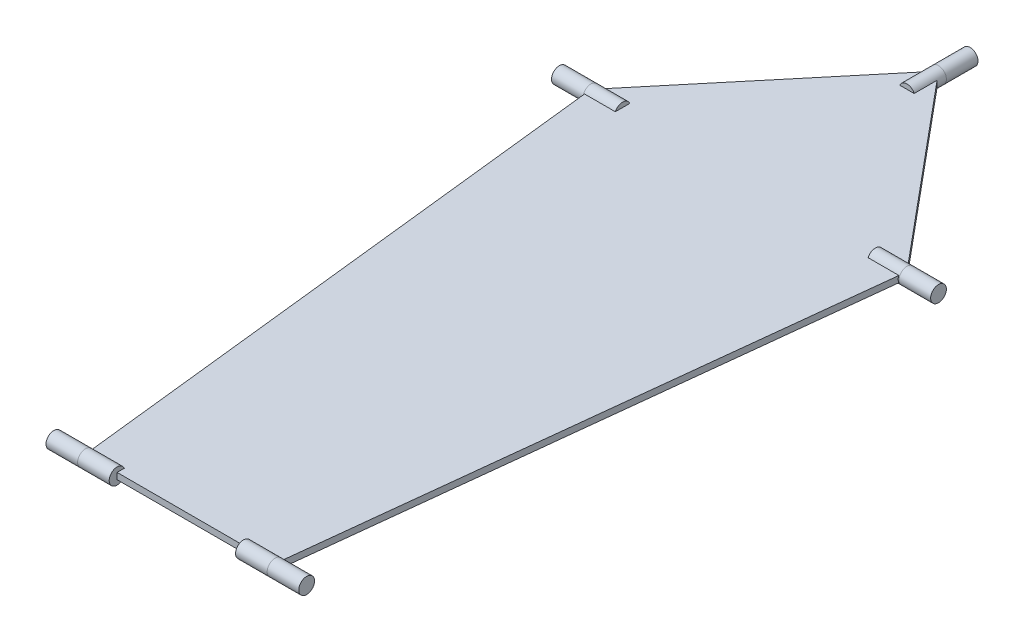
ISO-10303-21;
HEADER;
FILE_DESCRIPTION(('STEP AP214'),'2;1');
FILE_NAME('part.step','',(''),(''),'','','');
FILE_SCHEMA(('AUTOMOTIVE_DESIGN { 1 0 10303 214 1 1 1 1 }'));
ENDSEC;
DATA;
#1=APPLICATION_CONTEXT('core data for automotive mechanical design processes');
#2=APPLICATION_PROTOCOL_DEFINITION('international standard','automotive_design',2000,#1);
#3=PRODUCT_CONTEXT('',#1,'mechanical');
#4=PRODUCT('Part','Part','',(#3));
#5=PRODUCT_RELATED_PRODUCT_CATEGORY('part','',(#4));
#6=PRODUCT_DEFINITION_FORMATION('','',#4);
#7=PRODUCT_DEFINITION_CONTEXT('part definition',#1,'design');
#8=PRODUCT_DEFINITION('design','',#6,#7);
#9=PRODUCT_DEFINITION_SHAPE('','',#8);
#10=(LENGTH_UNIT() NAMED_UNIT(*) SI_UNIT(.MILLI.,.METRE.));
#11=(NAMED_UNIT(*) PLANE_ANGLE_UNIT() SI_UNIT($,.RADIAN.));
#12=(NAMED_UNIT(*) SI_UNIT($,.STERADIAN.) SOLID_ANGLE_UNIT());
#13=UNCERTAINTY_MEASURE_WITH_UNIT(LENGTH_MEASURE(1.E-05),#10,'distance_accuracy_value','');
#14=(GEOMETRIC_REPRESENTATION_CONTEXT(3) GLOBAL_UNCERTAINTY_ASSIGNED_CONTEXT((#13)) GLOBAL_UNIT_ASSIGNED_CONTEXT((#10,
#11,#12)) REPRESENTATION_CONTEXT('',''));
#15=CARTESIAN_POINT('',(0.,0.,0.));
#16=DIRECTION('',(0.,0.,1.));
#17=DIRECTION('',(1.,0.,0.));
#18=AXIS2_PLACEMENT_3D('',#15,#16,#17);
#19=CARTESIAN_POINT('',(0.,1.27,0.));
#20=DIRECTION('',(0.,1.,0.));
#21=DIRECTION('',(0.,0.,1.));
#22=AXIS2_PLACEMENT_3D('',#19,#20,#21);
#23=PLANE('',#22);
#24=DIRECTION('',(-1.,0.,0.));
#25=VECTOR('',#24,1.);
#26=CARTESIAN_POINT('',(2.28716997076464E-13,1.27,-139.7));
#27=LINE('',#26,#25);
#28=CARTESIAN_POINT('',(2.90993556629696,1.27,-139.7));
#29=VERTEX_POINT('',#28);
#30=CARTESIAN_POINT('',(-2.90993556629695,1.27,-139.7));
#31=VERTEX_POINT('',#30);
#32=EDGE_CURVE('E246',#29,#31,#27,.T.);
#33=ORIENTED_EDGE('',*,*,#32,.T.);
#34=DIRECTION('',(0.,0.,1.));
#35=VECTOR('',#34,1.);
#36=CARTESIAN_POINT('',(-2.90993556629694,1.27,-152.4));
#37=LINE('',#36,#35);
#38=CARTESIAN_POINT('',(-2.90993556629696,1.27,-148.908077320444));
#39=VERTEX_POINT('',#38);
#40=EDGE_CURVE('E236',#31,#39,#37,.F.);
#41=ORIENTED_EDGE('',*,*,#40,.T.);
#42=DIRECTION('',(-0.64018439966448,0.,0.768221279597376));
#43=VECTOR('',#42,1.);
#44=CARTESIAN_POINT('',(-63.5,1.27,-76.2));
#45=LINE('',#44,#43);
#46=CARTESIAN_POINT('',(-61.0750536947525,1.27,-79.1099355662969));
#47=VERTEX_POINT('',#46);
#48=EDGE_CURVE('E407',#39,#47,#45,.T.);
#49=ORIENTED_EDGE('',*,*,#48,.T.);
#50=DIRECTION('',(-1.,0.,0.));
#51=VECTOR('',#50,1.);
#52=CARTESIAN_POINT('',(-50.8,1.27,-79.1099355662969));
#53=LINE('',#52,#51);
#54=CARTESIAN_POINT('',(-50.8,1.27,-79.1099355662969));
#55=VERTEX_POINT('',#54);
#56=EDGE_CURVE('E378',#47,#55,#53,.F.);
#57=ORIENTED_EDGE('',*,*,#56,.T.);
#58=DIRECTION('',(0.,0.,-1.));
#59=VECTOR('',#58,1.);
#60=CARTESIAN_POINT('',(-50.8,1.27,0.));
#61=LINE('',#60,#59);
#62=CARTESIAN_POINT('',(-50.8,1.27,-73.290064433703));
#63=VERTEX_POINT('',#62);
#64=EDGE_CURVE('E381',#63,#55,#61,.T.);
#65=ORIENTED_EDGE('',*,*,#64,.F.);
#66=DIRECTION('',(-1.,0.,0.));
#67=VECTOR('',#66,1.);
#68=CARTESIAN_POINT('',(-50.8,1.27,-73.290064433703));
#69=LINE('',#68,#67);
#70=CARTESIAN_POINT('',(-63.176673825967,1.27,-73.290064433703));
#71=VERTEX_POINT('',#70);
#72=EDGE_CURVE('E371',#63,#71,#69,.T.);
#73=ORIENTED_EDGE('',*,*,#72,.T.);
#74=DIRECTION('',(0.110431526074847,0.,0.993883734673619));
#75=VECTOR('',#74,1.);
#76=CARTESIAN_POINT('',(-38.1,1.27,152.4));
#77=LINE('',#76,#75);
#78=CARTESIAN_POINT('',(-38.423326174033,1.27,149.490064433703));
#79=VERTEX_POINT('',#78);
#80=EDGE_CURVE('E399',#71,#79,#77,.T.);
#81=ORIENTED_EDGE('',*,*,#80,.T.);
#82=DIRECTION('',(-1.,0.,0.));
#83=VECTOR('',#82,1.);
#84=CARTESIAN_POINT('',(-38.1,1.27,149.490064433703));
#85=LINE('',#84,#83);
#86=CARTESIAN_POINT('',(-38.1,1.27,149.490064433703));
#87=VERTEX_POINT('',#86);
#88=EDGE_CURVE('E346',#87,#79,#85,.T.);
#89=ORIENTED_EDGE('',*,*,#88,.F.);
#90=DIRECTION('',(-1.,0.,0.));
#91=VECTOR('',#90,1.);
#92=CARTESIAN_POINT('',(-25.4,1.27,149.490064433703));
#93=LINE('',#92,#91);
#94=CARTESIAN_POINT('',(-25.4,1.27,149.490064433703));
#95=VERTEX_POINT('',#94);
#96=EDGE_CURVE('E350',#95,#87,#93,.T.);
#97=ORIENTED_EDGE('',*,*,#96,.F.);
#98=DIRECTION('',(0.,0.,1.));
#99=VECTOR('',#98,1.);
#100=CARTESIAN_POINT('',(-25.4,1.27,0.));
#101=LINE('',#100,#99);
#102=CARTESIAN_POINT('',(-25.4,1.27,152.4));
#103=VERTEX_POINT('',#102);
#104=EDGE_CURVE('E339',#95,#103,#101,.T.);
#105=ORIENTED_EDGE('',*,*,#104,.T.);
#106=DIRECTION('',(1.,0.,0.));
#107=VECTOR('',#106,1.);
#108=CARTESIAN_POINT('',(0.,1.27,152.4));
#109=LINE('',#108,#107);
#110=CARTESIAN_POINT('',(25.4,1.27,152.4));
#111=VERTEX_POINT('',#110);
#112=EDGE_CURVE('E403',#103,#111,#109,.T.);
#113=ORIENTED_EDGE('',*,*,#112,.T.);
#114=DIRECTION('',(0.,0.,-1.));
#115=VECTOR('',#114,1.);
#116=CARTESIAN_POINT('',(25.4,1.27,0.));
#117=LINE('',#116,#115);
#118=CARTESIAN_POINT('',(25.4,1.27,149.490064433703));
#119=VERTEX_POINT('',#118);
#120=EDGE_CURVE('E123',#111,#119,#117,.T.);
#121=ORIENTED_EDGE('',*,*,#120,.T.);
#122=DIRECTION('',(1.,0.,0.));
#123=VECTOR('',#122,1.);
#124=CARTESIAN_POINT('',(25.4,1.27,149.490064433703));
#125=LINE('',#124,#123);
#126=CARTESIAN_POINT('',(38.1,1.27,149.490064433703));
#127=VERTEX_POINT('',#126);
#128=EDGE_CURVE('E285',#127,#119,#125,.F.);
#129=ORIENTED_EDGE('',*,*,#128,.F.);
#130=DIRECTION('',(1.,0.,0.));
#131=VECTOR('',#130,1.);
#132=CARTESIAN_POINT('',(38.1,1.27,149.490064433703));
#133=LINE('',#132,#131);
#134=CARTESIAN_POINT('',(38.423326174033,1.27,149.490064433703));
#135=VERTEX_POINT('',#134);
#136=EDGE_CURVE('E275',#135,#127,#133,.F.);
#137=ORIENTED_EDGE('',*,*,#136,.F.);
#138=DIRECTION('',(-0.110431526074847,0.,0.993883734673619));
#139=VECTOR('',#138,1.);
#140=CARTESIAN_POINT('',(38.1,1.27,152.4));
#141=LINE('',#140,#139);
#142=CARTESIAN_POINT('',(63.176673825967,1.27,-73.290064433703));
#143=VERTEX_POINT('',#142);
#144=EDGE_CURVE('E386',#143,#135,#141,.T.);
#145=ORIENTED_EDGE('',*,*,#144,.F.);
#146=DIRECTION('',(1.,0.,0.));
#147=VECTOR('',#146,1.);
#148=CARTESIAN_POINT('',(50.8,1.27,-73.290064433703));
#149=LINE('',#148,#147);
#150=CARTESIAN_POINT('',(50.8,1.27,-73.290064433703));
#151=VERTEX_POINT('',#150);
#152=EDGE_CURVE('E316',#143,#151,#149,.F.);
#153=ORIENTED_EDGE('',*,*,#152,.T.);
#154=DIRECTION('',(0.,0.,1.));
#155=VECTOR('',#154,1.);
#156=CARTESIAN_POINT('',(50.8,1.27,0.));
#157=LINE('',#156,#155);
#158=CARTESIAN_POINT('',(50.8,1.27,-79.1099355662969));
#159=VERTEX_POINT('',#158);
#160=EDGE_CURVE('E320',#159,#151,#157,.T.);
#161=ORIENTED_EDGE('',*,*,#160,.F.);
#162=DIRECTION('',(1.,0.,0.));
#163=VECTOR('',#162,1.);
#164=CARTESIAN_POINT('',(50.8,1.27,-79.1099355662969));
#165=LINE('',#164,#163);
#166=CARTESIAN_POINT('',(61.0750536947525,1.27,-79.1099355662969));
#167=VERTEX_POINT('',#166);
#168=EDGE_CURVE('E305',#159,#167,#165,.T.);
#169=ORIENTED_EDGE('',*,*,#168,.T.);
#170=DIRECTION('',(0.64018439966448,0.,0.768221279597376));
#171=VECTOR('',#170,1.);
#172=CARTESIAN_POINT('',(63.5,1.27,-76.2));
#173=LINE('',#172,#171);
#174=CARTESIAN_POINT('',(2.909935566297,1.27,-148.908077320444));
#175=VERTEX_POINT('',#174);
#176=EDGE_CURVE('E389',#175,#167,#173,.T.);
#177=ORIENTED_EDGE('',*,*,#176,.F.);
#178=DIRECTION('',(0.,0.,1.));
#179=VECTOR('',#178,1.);
#180=CARTESIAN_POINT('',(2.90993556629698,1.27,-152.4));
#181=LINE('',#180,#179);
#182=EDGE_CURVE('E115',#175,#29,#181,.T.);
#183=ORIENTED_EDGE('',*,*,#182,.T.);
#184=EDGE_LOOP('',(#33,#41,#49,#57,#65,#73,#81,#89,#97,#105,#113,#121,#129,#137,#145,#153,#161,
#169,#177,#183));
#185=FACE_BOUND('',#184,.T.);
#186=ADVANCED_FACE('F99',(#185),#23,.T.);
#187=CARTESIAN_POINT('',(0.,-1.27,0.));
#188=DIRECTION('',(0.,1.,0.));
#189=DIRECTION('',(0.,0.,1.));
#190=AXIS2_PLACEMENT_3D('',#187,#188,#189);
#191=PLANE('',#190);
#192=DIRECTION('',(0.,0.,1.));
#193=VECTOR('',#192,1.);
#194=CARTESIAN_POINT('',(-2.90993556629694,-1.27,-152.4));
#195=LINE('',#194,#193);
#196=CARTESIAN_POINT('',(-2.90993556629695,-1.27,-139.7));
#197=VERTEX_POINT('',#196);
#198=CARTESIAN_POINT('',(-2.90993556629696,-1.27,-148.908077320444));
#199=VERTEX_POINT('',#198);
#200=EDGE_CURVE('E247',#197,#199,#195,.F.);
#201=ORIENTED_EDGE('',*,*,#200,.F.);
#202=DIRECTION('',(-1.,0.,0.));
#203=VECTOR('',#202,1.);
#204=CARTESIAN_POINT('',(2.28716997076464E-13,-1.27,-139.7));
#205=LINE('',#204,#203);
#206=CARTESIAN_POINT('',(2.90993556629696,-1.27,-139.7));
#207=VERTEX_POINT('',#206);
#208=EDGE_CURVE('E12',#207,#197,#205,.T.);
#209=ORIENTED_EDGE('',*,*,#208,.F.);
#210=DIRECTION('',(0.,0.,1.));
#211=VECTOR('',#210,1.);
#212=CARTESIAN_POINT('',(2.90993556629698,-1.27,-152.4));
#213=LINE('',#212,#211);
#214=CARTESIAN_POINT('',(2.909935566297,-1.27,-148.908077320444));
#215=VERTEX_POINT('',#214);
#216=EDGE_CURVE('E252',#215,#207,#213,.T.);
#217=ORIENTED_EDGE('',*,*,#216,.F.);
#218=DIRECTION('',(0.64018439966448,0.,0.768221279597376));
#219=VECTOR('',#218,1.);
#220=CARTESIAN_POINT('',(63.5,-1.27,-76.2));
#221=LINE('',#220,#219);
#222=CARTESIAN_POINT('',(61.0750536947525,-1.27,-79.1099355662969));
#223=VERTEX_POINT('',#222);
#224=EDGE_CURVE('E390',#215,#223,#221,.T.);
#225=ORIENTED_EDGE('',*,*,#224,.T.);
#226=DIRECTION('',(1.,0.,0.));
#227=VECTOR('',#226,1.);
#228=CARTESIAN_POINT('',(50.8,-1.27,-79.1099355662969));
#229=LINE('',#228,#227);
#230=CARTESIAN_POINT('',(50.8,-1.27,-79.1099355662969));
#231=VERTEX_POINT('',#230);
#232=EDGE_CURVE('E301',#231,#223,#229,.T.);
#233=ORIENTED_EDGE('',*,*,#232,.F.);
#234=DIRECTION('',(0.,0.,1.));
#235=VECTOR('',#234,1.);
#236=CARTESIAN_POINT('',(50.8,-1.27,0.));
#237=LINE('',#236,#235);
#238=CARTESIAN_POINT('',(50.8,-1.27,-73.290064433703));
#239=VERTEX_POINT('',#238);
#240=EDGE_CURVE('E444',#231,#239,#237,.T.);
#241=ORIENTED_EDGE('',*,*,#240,.T.);
#242=DIRECTION('',(1.,0.,0.));
#243=VECTOR('',#242,1.);
#244=CARTESIAN_POINT('',(50.8,-1.27,-73.290064433703));
#245=LINE('',#244,#243);
#246=CARTESIAN_POINT('',(63.176673825967,-1.27,-73.290064433703));
#247=VERTEX_POINT('',#246);
#248=EDGE_CURVE('E313',#247,#239,#245,.F.);
#249=ORIENTED_EDGE('',*,*,#248,.F.);
#250=DIRECTION('',(-0.110431526074847,0.,0.993883734673619));
#251=VECTOR('',#250,1.);
#252=CARTESIAN_POINT('',(38.1,-1.27,152.4));
#253=LINE('',#252,#251);
#254=CARTESIAN_POINT('',(38.423326174033,-1.27,149.490064433703));
#255=VERTEX_POINT('',#254);
#256=EDGE_CURVE('E385',#247,#255,#253,.T.);
#257=ORIENTED_EDGE('',*,*,#256,.T.);
#258=DIRECTION('',(1.,0.,0.));
#259=VECTOR('',#258,1.);
#260=CARTESIAN_POINT('',(38.1,-1.27,149.490064433703));
#261=LINE('',#260,#259);
#262=CARTESIAN_POINT('',(38.1,-1.27,149.490064433703));
#263=VERTEX_POINT('',#262);
#264=EDGE_CURVE('E272',#255,#263,#261,.F.);
#265=ORIENTED_EDGE('',*,*,#264,.T.);
#266=DIRECTION('',(1.,0.,0.));
#267=VECTOR('',#266,1.);
#268=CARTESIAN_POINT('',(25.4,-1.27,149.490064433703));
#269=LINE('',#268,#267);
#270=CARTESIAN_POINT('',(25.4,-1.27,149.490064433703));
#271=VERTEX_POINT('',#270);
#272=EDGE_CURVE('E456',#263,#271,#269,.F.);
#273=ORIENTED_EDGE('',*,*,#272,.T.);
#274=DIRECTION('',(0.,0.,-1.));
#275=VECTOR('',#274,1.);
#276=CARTESIAN_POINT('',(25.4,-1.27,0.));
#277=LINE('',#276,#275);
#278=CARTESIAN_POINT('',(25.4,-1.27,152.4));
#279=VERTEX_POINT('',#278);
#280=EDGE_CURVE('E279',#279,#271,#277,.T.);
#281=ORIENTED_EDGE('',*,*,#280,.F.);
#282=DIRECTION('',(1.,0.,0.));
#283=VECTOR('',#282,1.);
#284=CARTESIAN_POINT('',(0.,-1.27,152.4));
#285=LINE('',#284,#283);
#286=CARTESIAN_POINT('',(-25.4,-1.27,152.4));
#287=VERTEX_POINT('',#286);
#288=EDGE_CURVE('E414',#287,#279,#285,.T.);
#289=ORIENTED_EDGE('',*,*,#288,.F.);
#290=DIRECTION('',(0.,0.,1.));
#291=VECTOR('',#290,1.);
#292=CARTESIAN_POINT('',(-25.4,-1.27,0.));
#293=LINE('',#292,#291);
#294=CARTESIAN_POINT('',(-25.4,-1.27,149.490064433703));
#295=VERTEX_POINT('',#294);
#296=EDGE_CURVE('E335',#295,#287,#293,.T.);
#297=ORIENTED_EDGE('',*,*,#296,.F.);
#298=DIRECTION('',(-1.,0.,0.));
#299=VECTOR('',#298,1.);
#300=CARTESIAN_POINT('',(-25.4,-1.27,149.490064433703));
#301=LINE('',#300,#299);
#302=CARTESIAN_POINT('',(-38.1,-1.27,149.490064433703));
#303=VERTEX_POINT('',#302);
#304=EDGE_CURVE('E437',#295,#303,#301,.T.);
#305=ORIENTED_EDGE('',*,*,#304,.T.);
#306=DIRECTION('',(-1.,0.,0.));
#307=VECTOR('',#306,1.);
#308=CARTESIAN_POINT('',(-38.1,-1.27,149.490064433703));
#309=LINE('',#308,#307);
#310=CARTESIAN_POINT('',(-38.423326174033,-1.27,149.490064433703));
#311=VERTEX_POINT('',#310);
#312=EDGE_CURVE('E343',#303,#311,#309,.T.);
#313=ORIENTED_EDGE('',*,*,#312,.T.);
#314=DIRECTION('',(0.110431526074847,0.,0.993883734673619));
#315=VECTOR('',#314,1.);
#316=CARTESIAN_POINT('',(-38.1,-1.27,152.4));
#317=LINE('',#316,#315);
#318=CARTESIAN_POINT('',(-63.176673825967,-1.27,-73.290064433703));
#319=VERTEX_POINT('',#318);
#320=EDGE_CURVE('E393',#319,#311,#317,.T.);
#321=ORIENTED_EDGE('',*,*,#320,.F.);
#322=DIRECTION('',(-1.,0.,0.));
#323=VECTOR('',#322,1.);
#324=CARTESIAN_POINT('',(-50.8,-1.27,-73.290064433703));
#325=LINE('',#324,#323);
#326=CARTESIAN_POINT('',(-50.8,-1.27,-73.290064433703));
#327=VERTEX_POINT('',#326);
#328=EDGE_CURVE('E410',#327,#319,#325,.T.);
#329=ORIENTED_EDGE('',*,*,#328,.F.);
#330=DIRECTION('',(0.,0.,-1.));
#331=VECTOR('',#330,1.);
#332=CARTESIAN_POINT('',(-50.8,-1.27,0.));
#333=LINE('',#332,#331);
#334=CARTESIAN_POINT('',(-50.8,-1.27,-79.1099355662969));
#335=VERTEX_POINT('',#334);
#336=EDGE_CURVE('E423',#327,#335,#333,.T.);
#337=ORIENTED_EDGE('',*,*,#336,.T.);
#338=DIRECTION('',(-1.,0.,0.));
#339=VECTOR('',#338,1.);
#340=CARTESIAN_POINT('',(-50.8,-1.27,-79.1099355662969));
#341=LINE('',#340,#339);
#342=CARTESIAN_POINT('',(-61.0750536947525,-1.27,-79.1099355662969));
#343=VERTEX_POINT('',#342);
#344=EDGE_CURVE('E426',#343,#335,#341,.F.);
#345=ORIENTED_EDGE('',*,*,#344,.F.);
#346=DIRECTION('',(-0.64018439966448,0.,0.768221279597376));
#347=VECTOR('',#346,1.);
#348=CARTESIAN_POINT('',(-63.5,-1.27,-76.2));
#349=LINE('',#348,#347);
#350=EDGE_CURVE('E404',#199,#343,#349,.T.);
#351=ORIENTED_EDGE('',*,*,#350,.F.);
#352=EDGE_LOOP('',(#201,#209,#217,#225,#233,#241,#249,#257,#265,#273,#281,#289,#297,#305,#313,
#321,#329,#337,#345,#351));
#353=FACE_BOUND('',#352,.T.);
#354=ADVANCED_FACE('F488',(#353),#191,.F.);
#355=CARTESIAN_POINT('',(0.,1.27,152.4));
#356=DIRECTION('',(0.,0.,-1.));
#357=DIRECTION('',(-1.,0.,0.));
#358=AXIS2_PLACEMENT_3D('',#355,#356,#357);
#359=PLANE('',#358);
#360=DIRECTION('',(0.,-1.,0.));
#361=VECTOR('',#360,1.);
#362=CARTESIAN_POINT('',(25.4,1.27,152.4));
#363=LINE('',#362,#361);
#364=EDGE_CURVE('E452',#111,#279,#363,.T.);
#365=ORIENTED_EDGE('',*,*,#364,.F.);
#366=ORIENTED_EDGE('',*,*,#112,.F.);
#367=DIRECTION('',(0.,1.,0.));
#368=VECTOR('',#367,1.);
#369=CARTESIAN_POINT('',(-25.4,1.27,152.4));
#370=LINE('',#369,#368);
#371=EDGE_CURVE('E430',#287,#103,#370,.T.);
#372=ORIENTED_EDGE('',*,*,#371,.F.);
#373=ORIENTED_EDGE('',*,*,#288,.T.);
#374=EDGE_LOOP('',(#365,#366,#372,#373));
#375=FACE_BOUND('',#374,.T.);
#376=ADVANCED_FACE('F535',(#375),#359,.F.);
#377=CARTESIAN_POINT('',(-38.1,1.27,152.4));
#378=DIRECTION('',(0.993883734673619,0.,-0.110431526074847));
#379=DIRECTION('',(-0.110431526074847,0.,-0.993883734673619));
#380=AXIS2_PLACEMENT_3D('',#377,#378,#379);
#381=PLANE('',#380);
#382=ORIENTED_EDGE('',*,*,#320,.T.);
#383=CARTESIAN_POINT('',(-38.1,0.,152.4));
#384=DIRECTION('',(0.993883734673619,0.,-0.110431526074847));
#385=DIRECTION('',(-0.110431526074847,0.,-0.993883734673619));
#386=AXIS2_PLACEMENT_3D('',#383,#384,#385);
#387=ELLIPSE('',#386,3.19453864595404,3.17500000000001);
#388=EDGE_CURVE('E434',#311,#79,#387,.T.);
#389=ORIENTED_EDGE('',*,*,#388,.T.);
#390=ORIENTED_EDGE('',*,*,#80,.F.);
#391=CARTESIAN_POINT('',(-63.5,0.,-76.2));
#392=DIRECTION('',(0.993883734673619,0.,-0.110431526074847));
#393=DIRECTION('',(-0.110431526074847,0.,-0.993883734673619));
#394=AXIS2_PLACEMENT_3D('',#391,#392,#393);
#395=ELLIPSE('',#394,3.19453864595403,3.175);
#396=EDGE_CURVE('E367',#319,#71,#395,.F.);
#397=ORIENTED_EDGE('',*,*,#396,.F.);
#398=EDGE_LOOP('',(#382,#389,#390,#397));
#399=FACE_BOUND('',#398,.T.);
#400=ADVANCED_FACE('F101',(#399),#381,.F.);
#401=CARTESIAN_POINT('',(-63.5,1.27,-76.2));
#402=DIRECTION('',(0.768221279597376,0.,0.64018439966448));
#403=DIRECTION('',(0.64018439966448,0.,-0.768221279597376));
#404=AXIS2_PLACEMENT_3D('',#401,#402,#403);
#405=PLANE('',#404);
#406=CARTESIAN_POINT('',(0.,0.,-152.4));
#407=DIRECTION('',(0.768221279597376,0.,0.64018439966448));
#408=DIRECTION('',(-0.64018439966448,0.,0.768221279597376));
#409=AXIS2_PLACEMENT_3D('',#406,#407,#408);
#410=ELLIPSE('',#409,4.95950854420073,3.175);
#411=EDGE_CURVE('E242',#199,#39,#410,.F.);
#412=ORIENTED_EDGE('',*,*,#411,.F.);
#413=ORIENTED_EDGE('',*,*,#350,.T.);
#414=CARTESIAN_POINT('',(-63.5,0.,-76.2));
#415=DIRECTION('',(0.768221279597376,0.,0.64018439966448));
#416=DIRECTION('',(-0.64018439966448,0.,0.768221279597376));
#417=AXIS2_PLACEMENT_3D('',#414,#415,#416);
#418=ELLIPSE('',#417,4.13292378683393,3.175);
#419=EDGE_CURVE('E374',#47,#343,#418,.F.);
#420=ORIENTED_EDGE('',*,*,#419,.F.);
#421=ORIENTED_EDGE('',*,*,#48,.F.);
#422=EDGE_LOOP('',(#412,#413,#420,#421));
#423=FACE_BOUND('',#422,.T.);
#424=ADVANCED_FACE('F499',(#423),#405,.F.);
#425=CARTESIAN_POINT('',(38.1,1.27,152.4));
#426=DIRECTION('',(0.993883734673619,0.,0.110431526074847));
#427=DIRECTION('',(0.110431526074847,0.,-0.993883734673619));
#428=AXIS2_PLACEMENT_3D('',#425,#426,#427);
#429=PLANE('',#428);
#430=CARTESIAN_POINT('',(38.1,0.,152.4));
#431=DIRECTION('',(0.993883734673619,0.,0.110431526074847));
#432=DIRECTION('',(0.110431526074847,0.,-0.993883734673619));
#433=AXIS2_PLACEMENT_3D('',#430,#431,#432);
#434=ELLIPSE('',#433,3.19453864595404,3.17500000000001);
#435=EDGE_CURVE('E448',#255,#135,#434,.T.);
#436=ORIENTED_EDGE('',*,*,#435,.F.);
#437=ORIENTED_EDGE('',*,*,#256,.F.);
#438=CARTESIAN_POINT('',(63.5,0.,-76.2));
#439=DIRECTION('',(0.993883734673619,0.,0.110431526074847));
#440=DIRECTION('',(0.110431526074847,0.,-0.993883734673619));
#441=AXIS2_PLACEMENT_3D('',#438,#439,#440);
#442=ELLIPSE('',#441,3.19453864595403,3.175);
#443=EDGE_CURVE('E309',#247,#143,#442,.F.);
#444=ORIENTED_EDGE('',*,*,#443,.T.);
#445=ORIENTED_EDGE('',*,*,#144,.T.);
#446=EDGE_LOOP('',(#436,#437,#444,#445));
#447=FACE_BOUND('',#446,.T.);
#448=ADVANCED_FACE('F538',(#447),#429,.T.);
#449=CARTESIAN_POINT('',(63.5,1.27,-76.2));
#450=DIRECTION('',(0.768221279597376,0.,-0.64018439966448));
#451=DIRECTION('',(-0.64018439966448,0.,-0.768221279597376));
#452=AXIS2_PLACEMENT_3D('',#449,#450,#451);
#453=PLANE('',#452);
#454=ORIENTED_EDGE('',*,*,#224,.F.);
#455=CARTESIAN_POINT('',(0.,0.,-152.4));
#456=DIRECTION('',(0.768221279597376,0.,-0.64018439966448));
#457=DIRECTION('',(0.64018439966448,0.,0.768221279597376));
#458=AXIS2_PLACEMENT_3D('',#455,#456,#457);
#459=ELLIPSE('',#458,4.95950854420072,3.175);
#460=EDGE_CURVE('E108',#215,#175,#459,.F.);
#461=ORIENTED_EDGE('',*,*,#460,.T.);
#462=ORIENTED_EDGE('',*,*,#176,.T.);
#463=CARTESIAN_POINT('',(63.5,0.,-76.2));
#464=DIRECTION('',(0.768221279597376,0.,-0.64018439966448));
#465=DIRECTION('',(0.64018439966448,0.,0.768221279597376));
#466=AXIS2_PLACEMENT_3D('',#463,#464,#465);
#467=ELLIPSE('',#466,4.13292378683393,3.175);
#468=EDGE_CURVE('E440',#167,#223,#467,.F.);
#469=ORIENTED_EDGE('',*,*,#468,.T.);
#470=EDGE_LOOP('',(#454,#461,#462,#469));
#471=FACE_BOUND('',#470,.T.);
#472=ADVANCED_FACE('F461',(#471),#453,.T.);
#473=CARTESIAN_POINT('',(-50.8,0.,-76.2));
#474=DIRECTION('',(1.,0.,0.));
#475=DIRECTION('',(0.,0.,-1.));
#476=AXIS2_PLACEMENT_3D('',#473,#474,#475);
#477=PLANE('',#476);
#478=ORIENTED_EDGE('',*,*,#336,.F.);
#479=CARTESIAN_POINT('',(-50.8,0.,-76.2));
#480=DIRECTION('',(1.,0.,0.));
#481=DIRECTION('',(0.,0.,-1.));
#482=AXIS2_PLACEMENT_3D('',#479,#480,#481);
#483=CIRCLE('',#482,3.175);
#484=EDGE_CURVE('E354',#327,#335,#483,.T.);
#485=ORIENTED_EDGE('',*,*,#484,.T.);
#486=EDGE_LOOP('',(#478,#485));
#487=FACE_BOUND('',#486,.T.);
#488=ADVANCED_FACE('F478',(#487),#477,.T.);
#489=EDGE_CURVE('E355',#55,#63,#483,.T.);
#490=ORIENTED_EDGE('',*,*,#489,.T.);
#491=ORIENTED_EDGE('',*,*,#64,.T.);
#492=EDGE_LOOP('',(#490,#491));
#493=FACE_BOUND('',#492,.T.);
#494=ADVANCED_FACE('F497',(#493),#477,.T.);
#495=CARTESIAN_POINT('',(-76.2,0.,-76.2));
#496=DIRECTION('',(1.,0.,0.));
#497=DIRECTION('',(0.,0.,-1.));
#498=AXIS2_PLACEMENT_3D('',#495,#496,#497);
#499=PLANE('',#498);
#500=CARTESIAN_POINT('',(-76.2,0.,-76.2));
#501=DIRECTION('',(1.,0.,0.));
#502=DIRECTION('',(0.,0.,-1.));
#503=AXIS2_PLACEMENT_3D('',#500,#501,#502);
#504=CIRCLE('',#503,3.175);
#505=CARTESIAN_POINT('',(-76.2,0.,-79.375));
#506=VERTEX_POINT('',#505);
#507=EDGE_CURVE('E363',#506,#506,#504,.T.);
#508=ORIENTED_EDGE('',*,*,#507,.F.);
#509=EDGE_LOOP('',(#508));
#510=FACE_BOUND('',#509,.T.);
#511=ADVANCED_FACE('F602',(#510),#499,.F.);
#512=CARTESIAN_POINT('',(-50.8,0.,-76.2));
#513=DIRECTION('',(-1.,0.,0.));
#514=DIRECTION('',(0.,0.,1.));
#515=AXIS2_PLACEMENT_3D('',#512,#513,#514);
#516=CYLINDRICAL_SURFACE('',#515,3.175);
#517=ORIENTED_EDGE('',*,*,#56,.F.);
#518=ORIENTED_EDGE('',*,*,#419,.T.);
#519=ORIENTED_EDGE('',*,*,#344,.T.);
#520=ORIENTED_EDGE('',*,*,#484,.F.);
#521=ORIENTED_EDGE('',*,*,#328,.T.);
#522=ORIENTED_EDGE('',*,*,#396,.T.);
#523=ORIENTED_EDGE('',*,*,#72,.F.);
#524=ORIENTED_EDGE('',*,*,#489,.F.);
#525=EDGE_LOOP('',(#517,#518,#519,#520,#521,#522,#523,#524));
#526=FACE_BOUND('',#525,.T.);
#527=CARTESIAN_POINT('',(-63.5,0.,-76.2));
#528=DIRECTION('',(1.,0.,0.));
#529=DIRECTION('',(0.,0.,-1.));
#530=AXIS2_PLACEMENT_3D('',#527,#528,#529);
#531=CIRCLE('',#530,3.175);
#532=CARTESIAN_POINT('',(-63.5,0.,-79.375));
#533=VERTEX_POINT('',#532);
#534=EDGE_CURVE('E359',#533,#533,#531,.T.);
#535=ORIENTED_EDGE('',*,*,#534,.T.);
#536=EDGE_LOOP('',(#535));
#537=FACE_BOUND('',#536,.T.);
#538=ADVANCED_FACE('F481',(#526,#537),#516,.T.);
#539=CARTESIAN_POINT('',(-63.5,0.,-76.2));
#540=DIRECTION('',(-1.,0.,0.));
#541=DIRECTION('',(0.,0.,1.));
#542=AXIS2_PLACEMENT_3D('',#539,#540,#541);
#543=CYLINDRICAL_SURFACE('',#542,3.175);
#544=ORIENTED_EDGE('',*,*,#507,.T.);
#545=EDGE_LOOP('',(#544));
#546=FACE_BOUND('',#545,.T.);
#547=ORIENTED_EDGE('',*,*,#534,.F.);
#548=EDGE_LOOP('',(#547));
#549=FACE_BOUND('',#548,.T.);
#550=ADVANCED_FACE('F589',(#546,#549),#543,.T.);
#551=CARTESIAN_POINT('',(-25.4,0.,152.4));
#552=DIRECTION('',(-1.,0.,0.));
#553=DIRECTION('',(0.,0.,1.));
#554=AXIS2_PLACEMENT_3D('',#551,#552,#553);
#555=PLANE('',#554);
#556=ORIENTED_EDGE('',*,*,#104,.F.);
#557=CARTESIAN_POINT('',(-25.4,0.,152.4));
#558=DIRECTION('',(-1.,0.,0.));
#559=DIRECTION('',(0.,0.,1.));
#560=AXIS2_PLACEMENT_3D('',#557,#558,#559);
#561=CIRCLE('',#560,3.17500000000001);
#562=EDGE_CURVE('E323',#295,#95,#561,.T.);
#563=ORIENTED_EDGE('',*,*,#562,.F.);
#564=ORIENTED_EDGE('',*,*,#296,.T.);
#565=ORIENTED_EDGE('',*,*,#371,.T.);
#566=EDGE_LOOP('',(#556,#563,#564,#565));
#567=FACE_BOUND('',#566,.T.);
#568=ADVANCED_FACE('F573',(#567),#555,.F.);
#569=CARTESIAN_POINT('',(-50.8,0.,152.4));
#570=DIRECTION('',(-1.,0.,0.));
#571=DIRECTION('',(0.,0.,1.));
#572=AXIS2_PLACEMENT_3D('',#569,#570,#571);
#573=PLANE('',#572);
#574=CARTESIAN_POINT('',(-50.8,0.,152.4));
#575=DIRECTION('',(-1.,0.,0.));
#576=DIRECTION('',(0.,0.,1.));
#577=AXIS2_PLACEMENT_3D('',#574,#575,#576);
#578=CIRCLE('',#577,3.17500000000001);
#579=CARTESIAN_POINT('',(-50.8,0.,155.575));
#580=VERTEX_POINT('',#579);
#581=EDGE_CURVE('E331',#580,#580,#578,.T.);
#582=ORIENTED_EDGE('',*,*,#581,.T.);
#583=EDGE_LOOP('',(#582));
#584=FACE_BOUND('',#583,.T.);
#585=ADVANCED_FACE('F588',(#584),#573,.T.);
#586=CARTESIAN_POINT('',(-25.4,0.,152.4));
#587=DIRECTION('',(-1.,0.,0.));
#588=DIRECTION('',(0.,0.,1.));
#589=AXIS2_PLACEMENT_3D('',#586,#587,#588);
#590=CYLINDRICAL_SURFACE('',#589,3.17500000000001);
#591=ORIENTED_EDGE('',*,*,#562,.T.);
#592=ORIENTED_EDGE('',*,*,#96,.T.);
#593=CARTESIAN_POINT('',(-38.1,0.,152.4));
#594=DIRECTION('',(-1.,0.,0.));
#595=DIRECTION('',(0.,0.,1.));
#596=AXIS2_PLACEMENT_3D('',#593,#594,#595);
#597=CIRCLE('',#596,3.17500000000001);
#598=EDGE_CURVE('E327',#303,#87,#597,.T.);
#599=ORIENTED_EDGE('',*,*,#598,.F.);
#600=ORIENTED_EDGE('',*,*,#304,.F.);
#601=EDGE_LOOP('',(#591,#592,#599,#600));
#602=FACE_BOUND('',#601,.T.);
#603=ADVANCED_FACE('F579',(#602),#590,.T.);
#604=CARTESIAN_POINT('',(-38.1,0.,152.4));
#605=DIRECTION('',(-1.,0.,0.));
#606=DIRECTION('',(0.,0.,1.));
#607=AXIS2_PLACEMENT_3D('',#604,#605,#606);
#608=CYLINDRICAL_SURFACE('',#607,3.17500000000001);
#609=ORIENTED_EDGE('',*,*,#581,.F.);
#610=EDGE_LOOP('',(#609));
#611=FACE_BOUND('',#610,.T.);
#612=ORIENTED_EDGE('',*,*,#598,.T.);
#613=ORIENTED_EDGE('',*,*,#88,.T.);
#614=ORIENTED_EDGE('',*,*,#388,.F.);
#615=ORIENTED_EDGE('',*,*,#312,.F.);
#616=EDGE_LOOP('',(#612,#613,#614,#615));
#617=FACE_BOUND('',#616,.T.);
#618=ADVANCED_FACE('F570',(#611,#617),#608,.T.);
#619=CARTESIAN_POINT('',(50.8,0.,-76.2));
#620=DIRECTION('',(-1.,0.,0.));
#621=DIRECTION('',(0.,0.,-1.));
#622=AXIS2_PLACEMENT_3D('',#619,#620,#621);
#623=PLANE('',#622);
#624=ORIENTED_EDGE('',*,*,#240,.F.);
#625=CARTESIAN_POINT('',(50.8,0.,-76.2));
#626=DIRECTION('',(1.,0.,0.));
#627=DIRECTION('',(0.,0.,-1.));
#628=AXIS2_PLACEMENT_3D('',#625,#626,#627);
#629=CIRCLE('',#628,3.175);
#630=EDGE_CURVE('E289',#231,#239,#629,.F.);
#631=ORIENTED_EDGE('',*,*,#630,.T.);
#632=EDGE_LOOP('',(#624,#631));
#633=FACE_BOUND('',#632,.T.);
#634=ADVANCED_FACE('F568',(#633),#623,.T.);
#635=EDGE_CURVE('E288',#151,#159,#629,.F.);
#636=ORIENTED_EDGE('',*,*,#635,.T.);
#637=ORIENTED_EDGE('',*,*,#160,.T.);
#638=EDGE_LOOP('',(#636,#637));
#639=FACE_BOUND('',#638,.T.);
#640=ADVANCED_FACE('F471',(#639),#623,.T.);
#641=CARTESIAN_POINT('',(76.2,0.,-76.2));
#642=DIRECTION('',(-1.,0.,0.));
#643=DIRECTION('',(0.,0.,-1.));
#644=AXIS2_PLACEMENT_3D('',#641,#642,#643);
#645=PLANE('',#644);
#646=CARTESIAN_POINT('',(76.2,0.,-76.2));
#647=DIRECTION('',(1.,0.,0.));
#648=DIRECTION('',(0.,0.,-1.));
#649=AXIS2_PLACEMENT_3D('',#646,#647,#648);
#650=CIRCLE('',#649,3.175);
#651=CARTESIAN_POINT('',(76.2,0.,-79.375));
#652=VERTEX_POINT('',#651);
#653=EDGE_CURVE('E297',#652,#652,#650,.F.);
#654=ORIENTED_EDGE('',*,*,#653,.F.);
#655=EDGE_LOOP('',(#654));
#656=FACE_BOUND('',#655,.T.);
#657=ADVANCED_FACE('F578',(#656),#645,.F.);
#658=CARTESIAN_POINT('',(50.8,0.,-76.2));
#659=DIRECTION('',(1.,0.,0.));
#660=DIRECTION('',(0.,0.,-1.));
#661=AXIS2_PLACEMENT_3D('',#658,#659,#660);
#662=CYLINDRICAL_SURFACE('',#661,3.175);
#663=ORIENTED_EDGE('',*,*,#152,.F.);
#664=ORIENTED_EDGE('',*,*,#443,.F.);
#665=ORIENTED_EDGE('',*,*,#248,.T.);
#666=ORIENTED_EDGE('',*,*,#630,.F.);
#667=ORIENTED_EDGE('',*,*,#232,.T.);
#668=ORIENTED_EDGE('',*,*,#468,.F.);
#669=ORIENTED_EDGE('',*,*,#168,.F.);
#670=ORIENTED_EDGE('',*,*,#635,.F.);
#671=EDGE_LOOP('',(#663,#664,#665,#666,#667,#668,#669,#670));
#672=FACE_BOUND('',#671,.T.);
#673=CARTESIAN_POINT('',(63.5,0.,-76.2));
#674=DIRECTION('',(1.,0.,0.));
#675=DIRECTION('',(0.,0.,-1.));
#676=AXIS2_PLACEMENT_3D('',#673,#674,#675);
#677=CIRCLE('',#676,3.175);
#678=CARTESIAN_POINT('',(63.5,0.,-79.375));
#679=VERTEX_POINT('',#678);
#680=EDGE_CURVE('E293',#679,#679,#677,.F.);
#681=ORIENTED_EDGE('',*,*,#680,.T.);
#682=EDGE_LOOP('',(#681));
#683=FACE_BOUND('',#682,.T.);
#684=ADVANCED_FACE('F468',(#672,#683),#662,.T.);
#685=CARTESIAN_POINT('',(63.5,0.,-76.2));
#686=DIRECTION('',(1.,0.,0.));
#687=DIRECTION('',(0.,0.,-1.));
#688=AXIS2_PLACEMENT_3D('',#685,#686,#687);
#689=CYLINDRICAL_SURFACE('',#688,3.175);
#690=ORIENTED_EDGE('',*,*,#653,.T.);
#691=EDGE_LOOP('',(#690));
#692=FACE_BOUND('',#691,.T.);
#693=ORIENTED_EDGE('',*,*,#680,.F.);
#694=EDGE_LOOP('',(#693));
#695=FACE_BOUND('',#694,.T.);
#696=ADVANCED_FACE('F572',(#692,#695),#689,.T.);
#697=CARTESIAN_POINT('',(25.4,0.,152.4));
#698=DIRECTION('',(1.,0.,0.));
#699=DIRECTION('',(0.,0.,1.));
#700=AXIS2_PLACEMENT_3D('',#697,#698,#699);
#701=PLANE('',#700);
#702=ORIENTED_EDGE('',*,*,#120,.F.);
#703=ORIENTED_EDGE('',*,*,#364,.T.);
#704=ORIENTED_EDGE('',*,*,#280,.T.);
#705=CARTESIAN_POINT('',(25.4,0.,152.4));
#706=DIRECTION('',(-1.,0.,0.));
#707=DIRECTION('',(0.,0.,1.));
#708=AXIS2_PLACEMENT_3D('',#705,#706,#707);
#709=CIRCLE('',#708,3.17500000000001);
#710=EDGE_CURVE('E257',#119,#271,#709,.F.);
#711=ORIENTED_EDGE('',*,*,#710,.F.);
#712=EDGE_LOOP('',(#702,#703,#704,#711));
#713=FACE_BOUND('',#712,.T.);
#714=ADVANCED_FACE('F551',(#713),#701,.F.);
#715=CARTESIAN_POINT('',(50.8,0.,152.4));
#716=DIRECTION('',(1.,0.,0.));
#717=DIRECTION('',(0.,0.,1.));
#718=AXIS2_PLACEMENT_3D('',#715,#716,#717);
#719=PLANE('',#718);
#720=CARTESIAN_POINT('',(50.8,0.,152.4));
#721=DIRECTION('',(-1.,0.,0.));
#722=DIRECTION('',(0.,0.,1.));
#723=AXIS2_PLACEMENT_3D('',#720,#721,#722);
#724=CIRCLE('',#723,3.17500000000001);
#725=CARTESIAN_POINT('',(50.8,0.,155.575));
#726=VERTEX_POINT('',#725);
#727=EDGE_CURVE('E268',#726,#726,#724,.F.);
#728=ORIENTED_EDGE('',*,*,#727,.T.);
#729=EDGE_LOOP('',(#728));
#730=FACE_BOUND('',#729,.T.);
#731=ADVANCED_FACE('F671',(#730),#719,.T.);
#732=CARTESIAN_POINT('',(25.4,0.,152.4));
#733=DIRECTION('',(1.,0.,0.));
#734=DIRECTION('',(0.,0.,-1.));
#735=AXIS2_PLACEMENT_3D('',#732,#733,#734);
#736=CYLINDRICAL_SURFACE('',#735,3.17500000000001);
#737=CARTESIAN_POINT('',(38.1,0.,152.4));
#738=DIRECTION('',(-1.,0.,0.));
#739=DIRECTION('',(0.,0.,1.));
#740=AXIS2_PLACEMENT_3D('',#737,#738,#739);
#741=CIRCLE('',#740,3.17500000000001);
#742=EDGE_CURVE('E261',#127,#263,#741,.F.);
#743=ORIENTED_EDGE('',*,*,#742,.F.);
#744=ORIENTED_EDGE('',*,*,#128,.T.);
#745=ORIENTED_EDGE('',*,*,#710,.T.);
#746=ORIENTED_EDGE('',*,*,#272,.F.);
#747=EDGE_LOOP('',(#743,#744,#745,#746));
#748=FACE_BOUND('',#747,.T.);
#749=ADVANCED_FACE('F555',(#748),#736,.T.);
#750=CARTESIAN_POINT('',(38.1,0.,152.4));
#751=DIRECTION('',(1.,0.,0.));
#752=DIRECTION('',(0.,0.,-1.));
#753=AXIS2_PLACEMENT_3D('',#750,#751,#752);
#754=CYLINDRICAL_SURFACE('',#753,3.17500000000001);
#755=ORIENTED_EDGE('',*,*,#435,.T.);
#756=ORIENTED_EDGE('',*,*,#136,.T.);
#757=ORIENTED_EDGE('',*,*,#742,.T.);
#758=ORIENTED_EDGE('',*,*,#264,.F.);
#759=EDGE_LOOP('',(#755,#756,#757,#758));
#760=FACE_BOUND('',#759,.T.);
#761=ORIENTED_EDGE('',*,*,#727,.F.);
#762=EDGE_LOOP('',(#761));
#763=FACE_BOUND('',#762,.T.);
#764=ADVANCED_FACE('F559',(#760,#763),#754,.T.);
#765=CARTESIAN_POINT('',(0.,0.,-139.7));
#766=DIRECTION('',(0.,0.,-1.));
#767=DIRECTION('',(-1.,0.,0.));
#768=AXIS2_PLACEMENT_3D('',#765,#766,#767);
#769=PLANE('',#768);
#770=CARTESIAN_POINT('',(0.,0.,-139.7));
#771=DIRECTION('',(0.,0.,-1.));
#772=DIRECTION('',(-1.,0.,0.));
#773=AXIS2_PLACEMENT_3D('',#770,#771,#772);
#774=CIRCLE('',#773,3.175);
#775=EDGE_CURVE('E253',#207,#197,#774,.T.);
#776=ORIENTED_EDGE('',*,*,#775,.F.);
#777=ORIENTED_EDGE('',*,*,#208,.T.);
#778=EDGE_LOOP('',(#776,#777));
#779=FACE_BOUND('',#778,.T.);
#780=ADVANCED_FACE('F528',(#779),#769,.F.);
#781=CARTESIAN_POINT('',(4.74542309937019E-13,0.,-165.1));
#782=DIRECTION('',(0.,0.,-1.));
#783=DIRECTION('',(-1.,0.,0.));
#784=AXIS2_PLACEMENT_3D('',#781,#782,#783);
#785=PLANE('',#784);
#786=CARTESIAN_POINT('',(4.74542309937019E-13,0.,-165.1));
#787=DIRECTION('',(0.,0.,-1.));
#788=DIRECTION('',(-1.,0.,0.));
#789=AXIS2_PLACEMENT_3D('',#786,#787,#788);
#790=CIRCLE('',#789,3.175);
#791=CARTESIAN_POINT('',(-3.17499999999953,0.,-165.1));
#792=VERTEX_POINT('',#791);
#793=EDGE_CURVE('E512',#792,#792,#790,.T.);
#794=ORIENTED_EDGE('',*,*,#793,.T.);
#795=EDGE_LOOP('',(#794));
#796=FACE_BOUND('',#795,.T.);
#797=ADVANCED_FACE('F517',(#796),#785,.T.);
#798=ORIENTED_EDGE('',*,*,#32,.F.);
#799=EDGE_CURVE('E240',#31,#29,#774,.T.);
#800=ORIENTED_EDGE('',*,*,#799,.F.);
#801=EDGE_LOOP('',(#798,#800));
#802=FACE_BOUND('',#801,.T.);
#803=ADVANCED_FACE('F250',(#802),#769,.F.);
#804=CARTESIAN_POINT('',(4.74542309937019E-13,0.,-165.1));
#805=DIRECTION('',(0.,0.,1.));
#806=DIRECTION('',(1.,0.,0.));
#807=AXIS2_PLACEMENT_3D('',#804,#805,#806);
#808=CYLINDRICAL_SURFACE('',#807,3.175);
#809=CARTESIAN_POINT('',(4.96890065651614E-13,0.,-152.4));
#810=DIRECTION('',(0.,0.,-1.));
#811=DIRECTION('',(-1.,0.,0.));
#812=AXIS2_PLACEMENT_3D('',#809,#810,#811);
#813=CIRCLE('',#812,3.175);
#814=CARTESIAN_POINT('',(-3.1749999999995,0.,-152.4));
#815=VERTEX_POINT('',#814);
#816=EDGE_CURVE('E508',#815,#815,#813,.T.);
#817=ORIENTED_EDGE('',*,*,#816,.T.);
#818=EDGE_LOOP('',(#817));
#819=FACE_BOUND('',#818,.T.);
#820=ORIENTED_EDGE('',*,*,#793,.F.);
#821=EDGE_LOOP('',(#820));
#822=FACE_BOUND('',#821,.T.);
#823=ADVANCED_FACE('F519',(#819,#822),#808,.T.);
#824=CARTESIAN_POINT('',(0.,0.,-152.4));
#825=DIRECTION('',(0.,0.,1.));
#826=DIRECTION('',(1.,0.,0.));
#827=AXIS2_PLACEMENT_3D('',#824,#825,#826);
#828=CYLINDRICAL_SURFACE('',#827,3.175);
#829=ORIENTED_EDGE('',*,*,#40,.F.);
#830=ORIENTED_EDGE('',*,*,#799,.T.);
#831=ORIENTED_EDGE('',*,*,#182,.F.);
#832=ORIENTED_EDGE('',*,*,#460,.F.);
#833=ORIENTED_EDGE('',*,*,#216,.T.);
#834=ORIENTED_EDGE('',*,*,#775,.T.);
#835=ORIENTED_EDGE('',*,*,#200,.T.);
#836=ORIENTED_EDGE('',*,*,#411,.T.);
#837=EDGE_LOOP('',(#829,#830,#831,#832,#833,#834,#835,#836));
#838=FACE_BOUND('',#837,.T.);
#839=ORIENTED_EDGE('',*,*,#816,.F.);
#840=EDGE_LOOP('',(#839));
#841=FACE_BOUND('',#840,.T.);
#842=ADVANCED_FACE('F238',(#838,#841),#828,.T.);
#843=CLOSED_SHELL('',(#186,#354,#376,#400,#424,#448,#472,#488,#494,#511,#538,#550,#568,#585,
#603,#618,#634,#640,#657,#684,#696,#714,#731,#749,#764,#780,#797,#803,#823,#842));
#844=MANIFOLD_SOLID_BREP('B2',#843);
#845=ADVANCED_BREP_SHAPE_REPRESENTATION('',(#18,#844),#14);
#846=SHAPE_DEFINITION_REPRESENTATION(#9,#845);
ENDSEC;
END-ISO-10303-21;
